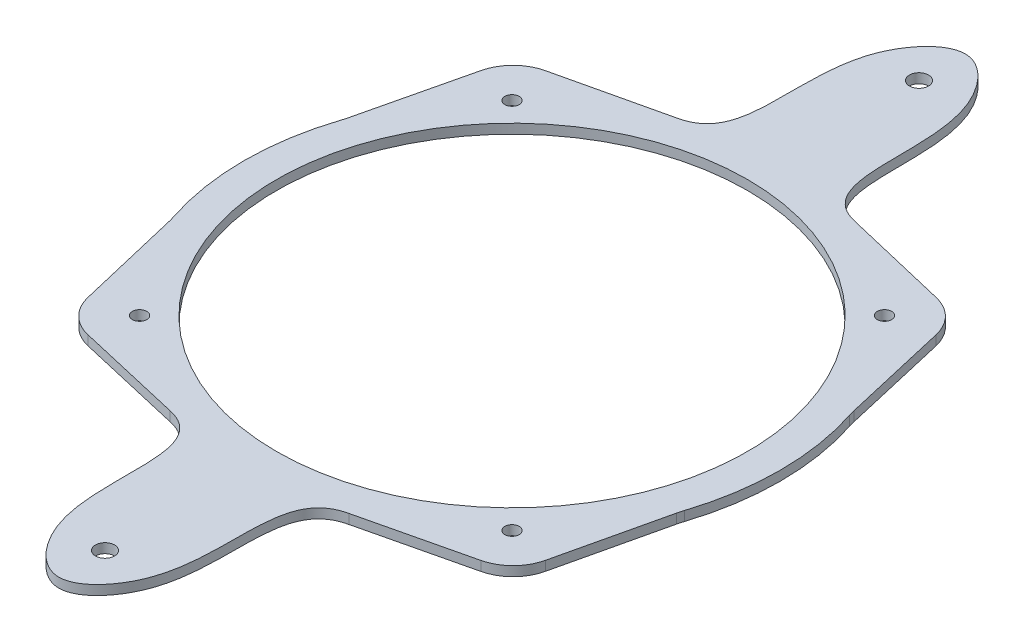
ISO-10303-21;
HEADER;
FILE_DESCRIPTION(('STEP AP214'),'2;1');
FILE_NAME('part.step','',(''),(''),'','','');
FILE_SCHEMA(('AUTOMOTIVE_DESIGN { 1 0 10303 214 1 1 1 1 }'));
ENDSEC;
DATA;
#1=APPLICATION_CONTEXT('core data for automotive mechanical design processes');
#2=APPLICATION_PROTOCOL_DEFINITION('international standard','automotive_design',2000,#1);
#3=PRODUCT_CONTEXT('',#1,'mechanical');
#4=PRODUCT('Part','Part','',(#3));
#5=PRODUCT_RELATED_PRODUCT_CATEGORY('part','',(#4));
#6=PRODUCT_DEFINITION_FORMATION('','',#4);
#7=PRODUCT_DEFINITION_CONTEXT('part definition',#1,'design');
#8=PRODUCT_DEFINITION('design','',#6,#7);
#9=PRODUCT_DEFINITION_SHAPE('','',#8);
#10=(LENGTH_UNIT() NAMED_UNIT(*) SI_UNIT(.MILLI.,.METRE.));
#11=(NAMED_UNIT(*) PLANE_ANGLE_UNIT() SI_UNIT($,.RADIAN.));
#12=(NAMED_UNIT(*) SI_UNIT($,.STERADIAN.) SOLID_ANGLE_UNIT());
#13=UNCERTAINTY_MEASURE_WITH_UNIT(LENGTH_MEASURE(1.E-05),#10,'distance_accuracy_value','');
#14=(GEOMETRIC_REPRESENTATION_CONTEXT(3) GLOBAL_UNCERTAINTY_ASSIGNED_CONTEXT((#13)) GLOBAL_UNIT_ASSIGNED_CONTEXT((#10,
#11,#12)) REPRESENTATION_CONTEXT('',''));
#15=CARTESIAN_POINT('',(0.,0.,0.));
#16=DIRECTION('',(0.,0.,1.));
#17=DIRECTION('',(1.,0.,0.));
#18=AXIS2_PLACEMENT_3D('',#15,#16,#17);
#19=CARTESIAN_POINT('',(-38.7862220051282,2.,-38.9952430761568));
#20=DIRECTION('',(0.,1.,0.));
#21=DIRECTION('',(0.,0.,1.));
#22=AXIS2_PLACEMENT_3D('',#19,#20,#21);
#23=PLANE('',#22);
#24=CARTESIAN_POINT('',(6.93889390390723E-13,2.,-85.));
#25=DIRECTION('',(0.,1.,0.));
#26=DIRECTION('',(0.,0.,1.));
#27=AXIS2_PLACEMENT_3D('',#24,#25,#26);
#28=CIRCLE('',#27,2.);
#29=CARTESIAN_POINT('',(6.93889390390723E-13,2.,-83.));
#30=VERTEX_POINT('',#29);
#31=EDGE_CURVE('E418',#30,#30,#28,.T.);
#32=ORIENTED_EDGE('',*,*,#31,.F.);
#33=EDGE_LOOP('',(#32));
#34=FACE_BOUND('',#33,.T.);
#35=CARTESIAN_POINT('',(-38.8906999999993,2.,38.8907000000005));
#36=DIRECTION('',(0.,1.,0.));
#37=DIRECTION('',(0.,0.,-1.));
#38=AXIS2_PLACEMENT_3D('',#35,#36,#37);
#39=CIRCLE('',#38,1.5);
#40=CARTESIAN_POINT('',(-38.8906999999993,2.,37.3907000000005));
#41=VERTEX_POINT('',#40);
#42=EDGE_CURVE('E402',#41,#41,#39,.T.);
#43=ORIENTED_EDGE('',*,*,#42,.F.);
#44=EDGE_LOOP('',(#43));
#45=FACE_BOUND('',#44,.T.);
#46=CARTESIAN_POINT('',(38.8907000000007,2.,-38.8906999999996));
#47=DIRECTION('',(0.,1.,0.));
#48=DIRECTION('',(0.,0.,-1.));
#49=AXIS2_PLACEMENT_3D('',#46,#47,#48);
#50=CIRCLE('',#49,1.5);
#51=CARTESIAN_POINT('',(38.8907000000007,2.,-40.3906999999996));
#52=VERTEX_POINT('',#51);
#53=EDGE_CURVE('E386',#52,#52,#50,.T.);
#54=ORIENTED_EDGE('',*,*,#53,.F.);
#55=EDGE_LOOP('',(#54));
#56=FACE_BOUND('',#55,.T.);
#57=CARTESIAN_POINT('',(-38.7862220051282,2.,-38.9952430761568));
#58=DIRECTION('',(0.,1.,0.));
#59=DIRECTION('',(0.,0.,1.));
#60=AXIS2_PLACEMENT_3D('',#57,#58,#59);
#61=CIRCLE('',#60,8.99999999999932);
#62=CARTESIAN_POINT('',(-40.8164016405644,2.,-47.7632742489942));
#63=VERTEX_POINT('',#62);
#64=CARTESIAN_POINT('',(-47.5432152727305,2.,-41.0725174709242));
#65=VERTEX_POINT('',#64);
#66=EDGE_CURVE('E318',#63,#65,#61,.T.);
#67=ORIENTED_EDGE('',*,*,#66,.T.);
#68=DIRECTION('',(-0.230808266085293,0.,0.972999251955879));
#69=VECTOR('',#68,1.);
#70=CARTESIAN_POINT('',(-52.8217319837832,2.,-18.8203126500064));
#71=LINE('',#70,#69);
#72=CARTESIAN_POINT('',(-52.8217319837832,2.,-18.8203126500064));
#73=VERTEX_POINT('',#72);
#74=EDGE_CURVE('E138',#65,#73,#71,.T.);
#75=ORIENTED_EDGE('',*,*,#74,.T.);
#76=CARTESIAN_POINT('',(-68.3897200150771,2.,-22.5132449073711));
#77=DIRECTION('',(0.,-1.,0.));
#78=DIRECTION('',(0.,0.,1.));
#79=AXIS2_PLACEMENT_3D('',#76,#77,#78);
#80=CIRCLE('',#79,15.9999999999999);
#81=CARTESIAN_POINT('',(-53.1920044561713,2.,-17.5103015946212));
#82=VERTEX_POINT('',#81);
#83=EDGE_CURVE('E313',#73,#82,#80,.T.);
#84=ORIENTED_EDGE('',*,*,#83,.T.);
#85=CARTESIAN_POINT('',(3.88578058618805E-13,2.,3.85108611666851E-13));
#86=DIRECTION('',(0.,1.,0.));
#87=DIRECTION('',(0.,0.,1.));
#88=AXIS2_PLACEMENT_3D('',#85,#86,#87);
#89=CIRCLE('',#88,56.);
#90=CARTESIAN_POINT('',(-53.1920044561713,2.,17.5103015946221));
#91=VERTEX_POINT('',#90);
#92=EDGE_CURVE('E310',#82,#91,#89,.T.);
#93=ORIENTED_EDGE('',*,*,#92,.T.);
#94=CARTESIAN_POINT('',(-68.3897200150771,2.,22.513244907372));
#95=DIRECTION('',(0.,-1.,0.));
#96=DIRECTION('',(0.,0.,-1.));
#97=AXIS2_PLACEMENT_3D('',#94,#95,#96);
#98=CIRCLE('',#97,15.9999999999999);
#99=CARTESIAN_POINT('',(-52.8217319837832,2.,18.8203126500073));
#100=VERTEX_POINT('',#99);
#101=EDGE_CURVE('E307',#91,#100,#98,.T.);
#102=ORIENTED_EDGE('',*,*,#101,.T.);
#103=DIRECTION('',(0.230808266085293,0.,0.972999251955879));
#104=VECTOR('',#103,1.);
#105=CARTESIAN_POINT('',(-52.8217319837832,2.,18.8203126500073));
#106=LINE('',#105,#104);
#107=CARTESIAN_POINT('',(-47.5432152727305,2.,41.0725174709251));
#108=VERTEX_POINT('',#107);
#109=EDGE_CURVE('E305',#100,#108,#106,.T.);
#110=ORIENTED_EDGE('',*,*,#109,.T.);
#111=CARTESIAN_POINT('',(-38.7862220051282,2.,38.9952430761577));
#112=DIRECTION('',(0.,1.,0.));
#113=DIRECTION('',(0.,0.,-1.));
#114=AXIS2_PLACEMENT_3D('',#111,#112,#113);
#115=CIRCLE('',#114,8.99999999999932);
#116=CARTESIAN_POINT('',(-40.8164016405644,2.,47.7632742489951));
#117=VERTEX_POINT('',#116);
#118=EDGE_CURVE('E303',#108,#117,#115,.T.);
#119=ORIENTED_EDGE('',*,*,#118,.T.);
#120=DIRECTION('',(0.974225685870893,0.,0.225575515048483));
#121=VECTOR('',#120,1.);
#122=CARTESIAN_POINT('',(-40.8164016405644,2.,47.7632742489951));
#123=LINE('',#122,#121);
#124=CARTESIAN_POINT('',(-18.5361486391086,2.,52.9221194930724));
#125=VERTEX_POINT('',#124);
#126=EDGE_CURVE('E276',#117,#125,#123,.T.);
#127=ORIENTED_EDGE('',*,*,#126,.T.);
#128=CARTESIAN_POINT('',(-18.5361486391086,2.,52.9221194930724));
#129=CARTESIAN_POINT('',(-6.536634722786,2.,55.4554250092448));
#130=CARTESIAN_POINT('',(-17.450586634744,2.,79.5032742089071));
#131=CARTESIAN_POINT('',(0.00798678998074194,2.,98.6838426986929));
#132=CARTESIAN_POINT('',(17.4365259114073,2.,79.4327843567498));
#133=CARTESIAN_POINT('',(6.79622758565099,2.,55.4361205118175));
#134=CARTESIAN_POINT('',(18.8203126500043,2.,52.8217319837792));
#135=B_SPLINE_CURVE_WITH_KNOTS('',3,(#128,#129,#130,#131,#132,#133,#134),.UNSPECIFIED.,.F.,.F.,
(4,1,1,1,4),(0.,0.36619004632466,0.499165373384125,0.632140700443589,1.),.UNSPECIFIED.);
#136=CARTESIAN_POINT('',(18.8203126500042,2.,52.8217319837801));
#137=VERTEX_POINT('',#136);
#138=EDGE_CURVE('E268',#125,#137,#135,.T.);
#139=ORIENTED_EDGE('',*,*,#138,.T.);
#140=DIRECTION('',(0.97299925195588,0.,-0.230808266085289));
#141=VECTOR('',#140,1.);
#142=CARTESIAN_POINT('',(18.8203126500042,2.,52.8217319837801));
#143=LINE('',#142,#141);
#144=CARTESIAN_POINT('',(41.072517470927,2.,47.5432152727264));
#145=VERTEX_POINT('',#144);
#146=EDGE_CURVE('E275',#137,#145,#143,.T.);
#147=ORIENTED_EDGE('',*,*,#146,.T.);
#148=CARTESIAN_POINT('',(38.9952430761595,2.,38.786222005124));
#149=DIRECTION('',(0.,1.,0.));
#150=DIRECTION('',(0.,0.,-1.));
#151=AXIS2_PLACEMENT_3D('',#148,#149,#150);
#152=CIRCLE('',#151,8.9999999999994);
#153=CARTESIAN_POINT('',(47.763274248997,2.,40.8164016405602));
#154=VERTEX_POINT('',#153);
#155=EDGE_CURVE('E283',#145,#154,#152,.T.);
#156=ORIENTED_EDGE('',*,*,#155,.T.);
#157=DIRECTION('',(0.22557551504848,0.,-0.974225685870894));
#158=VECTOR('',#157,1.);
#159=CARTESIAN_POINT('',(47.763274248997,2.,40.8164016405602));
#160=LINE('',#159,#158);
#161=CARTESIAN_POINT('',(52.9221194930679,2.,18.5361486391355));
#162=VERTEX_POINT('',#161);
#163=EDGE_CURVE('E286',#154,#162,#160,.T.);
#164=ORIENTED_EDGE('',*,*,#163,.T.);
#165=CARTESIAN_POINT('',(68.5097304670016,2.,22.1453568799111));
#166=DIRECTION('',(0.,-1.,0.));
#167=DIRECTION('',(0.,0.,-1.));
#168=AXIS2_PLACEMENT_3D('',#165,#166,#167);
#169=CIRCLE('',#168,15.9999999999995);
#170=CARTESIAN_POINT('',(53.2853459187792,2.,17.2241664621533));
#171=VERTEX_POINT('',#170);
#172=EDGE_CURVE('E289',#162,#171,#169,.T.);
#173=ORIENTED_EDGE('',*,*,#172,.T.);
#174=CARTESIAN_POINT('',(-1.04655030013431E-12,2.,2.06336822739891E-13));
#175=DIRECTION('',(0.,1.,0.));
#176=DIRECTION('',(0.,0.,1.));
#177=AXIS2_PLACEMENT_3D('',#174,#175,#176);
#178=CIRCLE('',#177,56.0000000000002);
#179=CARTESIAN_POINT('',(53.2853459187793,2.,-17.2241664621525));
#180=VERTEX_POINT('',#179);
#181=EDGE_CURVE('E292',#171,#180,#178,.T.);
#182=ORIENTED_EDGE('',*,*,#181,.T.);
#183=CARTESIAN_POINT('',(68.5097304670016,2.,-22.1453568799102));
#184=DIRECTION('',(0.,-1.,0.));
#185=DIRECTION('',(0.,0.,1.));
#186=AXIS2_PLACEMENT_3D('',#183,#184,#185);
#187=CIRCLE('',#186,15.9999999999995);
#188=CARTESIAN_POINT('',(52.9221194930679,2.,-18.5361486391347));
#189=VERTEX_POINT('',#188);
#190=EDGE_CURVE('E295',#180,#189,#187,.T.);
#191=ORIENTED_EDGE('',*,*,#190,.T.);
#192=DIRECTION('',(-0.22557551504848,0.,-0.974225685870894));
#193=VECTOR('',#192,1.);
#194=CARTESIAN_POINT('',(47.763274248997,2.,-40.8164016405593));
#195=LINE('',#194,#193);
#196=CARTESIAN_POINT('',(47.763274248997,2.,-40.8164016405593));
#197=VERTEX_POINT('',#196);
#198=EDGE_CURVE('E298',#189,#197,#195,.T.);
#199=ORIENTED_EDGE('',*,*,#198,.T.);
#200=CARTESIAN_POINT('',(38.9952430761595,2.,-38.7862220051232));
#201=DIRECTION('',(0.,1.,0.));
#202=DIRECTION('',(0.,0.,1.));
#203=AXIS2_PLACEMENT_3D('',#200,#201,#202);
#204=CIRCLE('',#203,8.9999999999994);
#205=CARTESIAN_POINT('',(41.072517470927,2.,-47.5432152727255));
#206=VERTEX_POINT('',#205);
#207=EDGE_CURVE('E193',#197,#206,#204,.T.);
#208=ORIENTED_EDGE('',*,*,#207,.T.);
#209=DIRECTION('',(-0.97299925195588,0.,-0.230808266085289));
#210=VECTOR('',#209,1.);
#211=CARTESIAN_POINT('',(18.8203126500042,2.,-52.8217319837792));
#212=LINE('',#211,#210);
#213=CARTESIAN_POINT('',(18.8203126500043,2.,-52.8217319837792));
#214=VERTEX_POINT('',#213);
#215=EDGE_CURVE('E187',#206,#214,#212,.T.);
#216=ORIENTED_EDGE('',*,*,#215,.T.);
#217=CARTESIAN_POINT('',(18.8203126500043,2.,-52.8217319837792));
#218=CARTESIAN_POINT('',(6.79622758565085,2.,-55.4361205118174));
#219=CARTESIAN_POINT('',(17.4365259114074,2.,-79.4327843567499));
#220=CARTESIAN_POINT('',(0.00798678998073036,2.,-98.6838426986929));
#221=CARTESIAN_POINT('',(-17.450586634744,2.,-79.5032742089071));
#222=CARTESIAN_POINT('',(-6.53663472278595,2.,-55.4554250092448));
#223=CARTESIAN_POINT('',(-18.5361486391086,2.,-52.9221194930724));
#224=B_SPLINE_CURVE_WITH_KNOTS('',3,(#217,#218,#219,#220,#221,#222,#223),.UNSPECIFIED.,.F.,.F.,
(4,1,1,1,4),(0.,0.367859299556411,0.500834626615875,0.63380995367534,1.),.UNSPECIFIED.);
#225=CARTESIAN_POINT('',(-18.5361486391085,2.,-52.9221194930725));
#226=VERTEX_POINT('',#225);
#227=EDGE_CURVE('E191',#214,#226,#224,.T.);
#228=ORIENTED_EDGE('',*,*,#227,.T.);
#229=DIRECTION('',(-0.974225685870893,0.,0.225575515048483));
#230=VECTOR('',#229,1.);
#231=CARTESIAN_POINT('',(-40.8164016405644,2.,-47.7632742489942));
#232=LINE('',#231,#230);
#233=EDGE_CURVE('E59',#226,#63,#232,.T.);
#234=ORIENTED_EDGE('',*,*,#233,.T.);
#235=EDGE_LOOP('',(#67,#75,#84,#93,#102,#110,#119,#127,#139,#147,#156,#164,#173,#182,#191,#199,
#208,#216,#228,#234));
#236=FACE_BOUND('',#235,.T.);
#237=CARTESIAN_POINT('',(-38.8906999999993,2.,-38.8906999999996));
#238=DIRECTION('',(0.,1.,0.));
#239=DIRECTION('',(0.,0.,1.));
#240=AXIS2_PLACEMENT_3D('',#237,#238,#239);
#241=CIRCLE('',#240,1.5);
#242=CARTESIAN_POINT('',(-38.8906999999993,2.,-37.3906999999996));
#243=VERTEX_POINT('',#242);
#244=EDGE_CURVE('E379',#243,#243,#241,.T.);
#245=ORIENTED_EDGE('',*,*,#244,.F.);
#246=EDGE_LOOP('',(#245));
#247=FACE_BOUND('',#246,.T.);
#248=CARTESIAN_POINT('',(38.8907000000007,2.,38.8907000000005));
#249=DIRECTION('',(0.,1.,0.));
#250=DIRECTION('',(0.,0.,1.));
#251=AXIS2_PLACEMENT_3D('',#248,#249,#250);
#252=CIRCLE('',#251,1.5);
#253=CARTESIAN_POINT('',(38.8907000000007,2.,40.3907000000005));
#254=VERTEX_POINT('',#253);
#255=EDGE_CURVE('E394',#254,#254,#252,.T.);
#256=ORIENTED_EDGE('',*,*,#255,.F.);
#257=EDGE_LOOP('',(#256));
#258=FACE_BOUND('',#257,.T.);
#259=CARTESIAN_POINT('',(-1.04655030013431E-12,2.,2.06336822739891E-13));
#260=DIRECTION('',(0.,1.,0.));
#261=DIRECTION('',(0.,0.,1.));
#262=AXIS2_PLACEMENT_3D('',#259,#260,#261);
#263=CIRCLE('',#262,49.2);
#264=CARTESIAN_POINT('',(-1.04655030013431E-12,2.,49.2000000000002));
#265=VERTEX_POINT('',#264);
#266=EDGE_CURVE('E410',#265,#265,#263,.T.);
#267=ORIENTED_EDGE('',*,*,#266,.F.);
#268=EDGE_LOOP('',(#267));
#269=FACE_BOUND('',#268,.T.);
#270=CARTESIAN_POINT('',(6.93889390390723E-13,2.,85.));
#271=DIRECTION('',(0.,1.,0.));
#272=DIRECTION('',(0.,0.,-1.));
#273=AXIS2_PLACEMENT_3D('',#270,#271,#272);
#274=CIRCLE('',#273,2.);
#275=CARTESIAN_POINT('',(6.93889390390723E-13,2.,83.));
#276=VERTEX_POINT('',#275);
#277=EDGE_CURVE('E426',#276,#276,#274,.T.);
#278=ORIENTED_EDGE('',*,*,#277,.F.);
#279=EDGE_LOOP('',(#278));
#280=FACE_BOUND('',#279,.T.);
#281=ADVANCED_FACE('F41',(#34,#45,#56,#236,#247,#258,#269,#280),#23,.T.);
#282=CARTESIAN_POINT('',(-38.7862220051282,0.,-38.9952430761568));
#283=DIRECTION('',(0.,1.,0.));
#284=DIRECTION('',(0.,0.,1.));
#285=AXIS2_PLACEMENT_3D('',#282,#283,#284);
#286=PLANE('',#285);
#287=CARTESIAN_POINT('',(-38.7862220051282,0.,-38.9952430761568));
#288=DIRECTION('',(0.,1.,0.));
#289=DIRECTION('',(0.,0.,1.));
#290=AXIS2_PLACEMENT_3D('',#287,#288,#289);
#291=CIRCLE('',#290,8.99999999999932);
#292=CARTESIAN_POINT('',(-40.8164016405644,0.,-47.7632742489942));
#293=VERTEX_POINT('',#292);
#294=CARTESIAN_POINT('',(-47.5432152727305,0.,-41.0725174709242));
#295=VERTEX_POINT('',#294);
#296=EDGE_CURVE('E375',#293,#295,#291,.T.);
#297=ORIENTED_EDGE('',*,*,#296,.F.);
#298=DIRECTION('',(-0.974225685870893,0.,0.225575515048483));
#299=VECTOR('',#298,1.);
#300=CARTESIAN_POINT('',(-40.8164016405644,0.,-47.7632742489942));
#301=LINE('',#300,#299);
#302=CARTESIAN_POINT('',(-18.5361486391085,0.,-52.9221194930725));
#303=VERTEX_POINT('',#302);
#304=EDGE_CURVE('E130',#303,#293,#301,.T.);
#305=ORIENTED_EDGE('',*,*,#304,.F.);
#306=CARTESIAN_POINT('',(18.8203126500043,0.,-52.8217319837792));
#307=CARTESIAN_POINT('',(6.79622758565085,0.,-55.4361205118174));
#308=CARTESIAN_POINT('',(17.4365259114074,0.,-79.4327843567499));
#309=CARTESIAN_POINT('',(0.00798678998073036,0.,-98.6838426986929));
#310=CARTESIAN_POINT('',(-17.450586634744,0.,-79.5032742089071));
#311=CARTESIAN_POINT('',(-6.53663472278595,0.,-55.4554250092448));
#312=CARTESIAN_POINT('',(-18.5361486391086,0.,-52.9221194930724));
#313=B_SPLINE_CURVE_WITH_KNOTS('',3,(#306,#307,#308,#309,#310,#311,#312),.UNSPECIFIED.,.F.,.F.,
(4,1,1,1,4),(0.,0.367859299556411,0.500834626615875,0.63380995367534,1.),.UNSPECIFIED.);
#314=CARTESIAN_POINT('',(18.8203126500043,0.,-52.8217319837792));
#315=VERTEX_POINT('',#314);
#316=EDGE_CURVE('E124',#315,#303,#313,.T.);
#317=ORIENTED_EDGE('',*,*,#316,.F.);
#318=DIRECTION('',(-0.97299925195588,0.,-0.230808266085289));
#319=VECTOR('',#318,1.);
#320=CARTESIAN_POINT('',(18.8203126500042,0.,-52.8217319837792));
#321=LINE('',#320,#319);
#322=CARTESIAN_POINT('',(41.072517470927,0.,-47.5432152727255));
#323=VERTEX_POINT('',#322);
#324=EDGE_CURVE('E202',#323,#315,#321,.T.);
#325=ORIENTED_EDGE('',*,*,#324,.F.);
#326=CARTESIAN_POINT('',(38.9952430761595,0.,-38.7862220051232));
#327=DIRECTION('',(0.,1.,0.));
#328=DIRECTION('',(0.,0.,1.));
#329=AXIS2_PLACEMENT_3D('',#326,#327,#328);
#330=CIRCLE('',#329,8.9999999999994);
#331=CARTESIAN_POINT('',(47.763274248997,0.,-40.8164016405593));
#332=VERTEX_POINT('',#331);
#333=EDGE_CURVE('E327',#332,#323,#330,.T.);
#334=ORIENTED_EDGE('',*,*,#333,.F.);
#335=DIRECTION('',(-0.22557551504848,0.,-0.974225685870894));
#336=VECTOR('',#335,1.);
#337=CARTESIAN_POINT('',(47.763274248997,0.,-40.8164016405593));
#338=LINE('',#337,#336);
#339=CARTESIAN_POINT('',(52.9221194930679,0.,-18.5361486391347));
#340=VERTEX_POINT('',#339);
#341=EDGE_CURVE('E330',#340,#332,#338,.T.);
#342=ORIENTED_EDGE('',*,*,#341,.F.);
#343=CARTESIAN_POINT('',(68.5097304670016,0.,-22.1453568799102));
#344=DIRECTION('',(0.,-1.,0.));
#345=DIRECTION('',(0.,0.,1.));
#346=AXIS2_PLACEMENT_3D('',#343,#344,#345);
#347=CIRCLE('',#346,15.9999999999995);
#348=CARTESIAN_POINT('',(53.2853459187793,0.,-17.2241664621525));
#349=VERTEX_POINT('',#348);
#350=EDGE_CURVE('E333',#349,#340,#347,.T.);
#351=ORIENTED_EDGE('',*,*,#350,.F.);
#352=CARTESIAN_POINT('',(-1.04655030013431E-12,0.,2.06336822739891E-13));
#353=DIRECTION('',(0.,1.,0.));
#354=DIRECTION('',(0.,0.,1.));
#355=AXIS2_PLACEMENT_3D('',#352,#353,#354);
#356=CIRCLE('',#355,56.0000000000002);
#357=CARTESIAN_POINT('',(53.2853459187792,0.,17.2241664621533));
#358=VERTEX_POINT('',#357);
#359=EDGE_CURVE('E336',#358,#349,#356,.T.);
#360=ORIENTED_EDGE('',*,*,#359,.F.);
#361=CARTESIAN_POINT('',(68.5097304670016,0.,22.1453568799111));
#362=DIRECTION('',(0.,-1.,0.));
#363=DIRECTION('',(0.,0.,-1.));
#364=AXIS2_PLACEMENT_3D('',#361,#362,#363);
#365=CIRCLE('',#364,15.9999999999995);
#366=CARTESIAN_POINT('',(52.9221194930679,0.,18.5361486391355));
#367=VERTEX_POINT('',#366);
#368=EDGE_CURVE('E339',#367,#358,#365,.T.);
#369=ORIENTED_EDGE('',*,*,#368,.F.);
#370=DIRECTION('',(0.22557551504848,0.,-0.974225685870894));
#371=VECTOR('',#370,1.);
#372=CARTESIAN_POINT('',(47.763274248997,0.,40.8164016405602));
#373=LINE('',#372,#371);
#374=CARTESIAN_POINT('',(47.763274248997,0.,40.8164016405602));
#375=VERTEX_POINT('',#374);
#376=EDGE_CURVE('E342',#375,#367,#373,.T.);
#377=ORIENTED_EDGE('',*,*,#376,.F.);
#378=CARTESIAN_POINT('',(38.9952430761595,0.,38.786222005124));
#379=DIRECTION('',(0.,1.,0.));
#380=DIRECTION('',(0.,0.,-1.));
#381=AXIS2_PLACEMENT_3D('',#378,#379,#380);
#382=CIRCLE('',#381,8.9999999999994);
#383=CARTESIAN_POINT('',(41.072517470927,0.,47.5432152727264));
#384=VERTEX_POINT('',#383);
#385=EDGE_CURVE('E345',#384,#375,#382,.T.);
#386=ORIENTED_EDGE('',*,*,#385,.F.);
#387=DIRECTION('',(0.97299925195588,0.,-0.230808266085289));
#388=VECTOR('',#387,1.);
#389=CARTESIAN_POINT('',(18.8203126500042,0.,52.8217319837801));
#390=LINE('',#389,#388);
#391=CARTESIAN_POINT('',(18.8203126500042,0.,52.8217319837801));
#392=VERTEX_POINT('',#391);
#393=EDGE_CURVE('E348',#392,#384,#390,.T.);
#394=ORIENTED_EDGE('',*,*,#393,.F.);
#395=CARTESIAN_POINT('',(-18.5361486391086,0.,52.9221194930724));
#396=CARTESIAN_POINT('',(-6.536634722786,0.,55.4554250092448));
#397=CARTESIAN_POINT('',(-17.450586634744,0.,79.5032742089071));
#398=CARTESIAN_POINT('',(0.00798678998074194,0.,98.6838426986929));
#399=CARTESIAN_POINT('',(17.4365259114073,0.,79.4327843567498));
#400=CARTESIAN_POINT('',(6.79622758565099,0.,55.4361205118175));
#401=CARTESIAN_POINT('',(18.8203126500043,0.,52.8217319837792));
#402=B_SPLINE_CURVE_WITH_KNOTS('',3,(#395,#396,#397,#398,#399,#400,#401),.UNSPECIFIED.,.F.,.F.,
(4,1,1,1,4),(0.,0.36619004632466,0.499165373384125,0.632140700443589,1.),.UNSPECIFIED.);
#403=CARTESIAN_POINT('',(-18.5361486391086,0.,52.9221194930724));
#404=VERTEX_POINT('',#403);
#405=EDGE_CURVE('E351',#404,#392,#402,.T.);
#406=ORIENTED_EDGE('',*,*,#405,.F.);
#407=DIRECTION('',(0.974225685870893,0.,0.225575515048483));
#408=VECTOR('',#407,1.);
#409=CARTESIAN_POINT('',(-40.8164016405644,0.,47.7632742489951));
#410=LINE('',#409,#408);
#411=CARTESIAN_POINT('',(-40.8164016405644,0.,47.7632742489951));
#412=VERTEX_POINT('',#411);
#413=EDGE_CURVE('E354',#412,#404,#410,.T.);
#414=ORIENTED_EDGE('',*,*,#413,.F.);
#415=CARTESIAN_POINT('',(-38.7862220051282,0.,38.9952430761577));
#416=DIRECTION('',(0.,1.,0.));
#417=DIRECTION('',(0.,0.,-1.));
#418=AXIS2_PLACEMENT_3D('',#415,#416,#417);
#419=CIRCLE('',#418,8.99999999999932);
#420=CARTESIAN_POINT('',(-47.5432152727305,0.,41.0725174709251));
#421=VERTEX_POINT('',#420);
#422=EDGE_CURVE('E357',#421,#412,#419,.T.);
#423=ORIENTED_EDGE('',*,*,#422,.F.);
#424=DIRECTION('',(0.230808266085293,0.,0.972999251955879));
#425=VECTOR('',#424,1.);
#426=CARTESIAN_POINT('',(-52.8217319837832,0.,18.8203126500073));
#427=LINE('',#426,#425);
#428=CARTESIAN_POINT('',(-52.8217319837832,0.,18.8203126500073));
#429=VERTEX_POINT('',#428);
#430=EDGE_CURVE('E360',#429,#421,#427,.T.);
#431=ORIENTED_EDGE('',*,*,#430,.F.);
#432=CARTESIAN_POINT('',(-68.3897200150771,0.,22.513244907372));
#433=DIRECTION('',(0.,-1.,0.));
#434=DIRECTION('',(0.,0.,-1.));
#435=AXIS2_PLACEMENT_3D('',#432,#433,#434);
#436=CIRCLE('',#435,15.9999999999999);
#437=CARTESIAN_POINT('',(-53.1920044561713,0.,17.5103015946221));
#438=VERTEX_POINT('',#437);
#439=EDGE_CURVE('E363',#438,#429,#436,.T.);
#440=ORIENTED_EDGE('',*,*,#439,.F.);
#441=CARTESIAN_POINT('',(3.88578058618805E-13,0.,3.85108611666851E-13));
#442=DIRECTION('',(0.,1.,0.));
#443=DIRECTION('',(0.,0.,1.));
#444=AXIS2_PLACEMENT_3D('',#441,#442,#443);
#445=CIRCLE('',#444,56.);
#446=CARTESIAN_POINT('',(-53.1920044561713,0.,-17.5103015946212));
#447=VERTEX_POINT('',#446);
#448=EDGE_CURVE('E366',#447,#438,#445,.T.);
#449=ORIENTED_EDGE('',*,*,#448,.F.);
#450=CARTESIAN_POINT('',(-68.3897200150771,0.,-22.5132449073711));
#451=DIRECTION('',(0.,-1.,0.));
#452=DIRECTION('',(0.,0.,1.));
#453=AXIS2_PLACEMENT_3D('',#450,#451,#452);
#454=CIRCLE('',#453,15.9999999999999);
#455=CARTESIAN_POINT('',(-52.8217319837832,0.,-18.8203126500064));
#456=VERTEX_POINT('',#455);
#457=EDGE_CURVE('E369',#456,#447,#454,.T.);
#458=ORIENTED_EDGE('',*,*,#457,.F.);
#459=DIRECTION('',(-0.230808266085293,0.,0.972999251955879));
#460=VECTOR('',#459,1.);
#461=CARTESIAN_POINT('',(-52.8217319837832,0.,-18.8203126500064));
#462=LINE('',#461,#460);
#463=EDGE_CURVE('E372',#295,#456,#462,.T.);
#464=ORIENTED_EDGE('',*,*,#463,.F.);
#465=EDGE_LOOP('',(#297,#305,#317,#325,#334,#342,#351,#360,#369,#377,#386,#394,#406,#414,#423,
#431,#440,#449,#458,#464));
#466=FACE_BOUND('',#465,.T.);
#467=CARTESIAN_POINT('',(-38.8906999999993,0.,-38.8906999999996));
#468=DIRECTION('',(0.,1.,0.));
#469=DIRECTION('',(0.,0.,1.));
#470=AXIS2_PLACEMENT_3D('',#467,#468,#469);
#471=CIRCLE('',#470,1.5);
#472=CARTESIAN_POINT('',(-38.8906999999993,0.,-37.3906999999996));
#473=VERTEX_POINT('',#472);
#474=EDGE_CURVE('E382',#473,#473,#471,.T.);
#475=ORIENTED_EDGE('',*,*,#474,.T.);
#476=EDGE_LOOP('',(#475));
#477=FACE_BOUND('',#476,.T.);
#478=CARTESIAN_POINT('',(38.8907000000007,0.,-38.8906999999996));
#479=DIRECTION('',(0.,1.,0.));
#480=DIRECTION('',(0.,0.,-1.));
#481=AXIS2_PLACEMENT_3D('',#478,#479,#480);
#482=CIRCLE('',#481,1.5);
#483=CARTESIAN_POINT('',(38.8907000000007,0.,-40.3906999999996));
#484=VERTEX_POINT('',#483);
#485=EDGE_CURVE('E390',#484,#484,#482,.T.);
#486=ORIENTED_EDGE('',*,*,#485,.T.);
#487=EDGE_LOOP('',(#486));
#488=FACE_BOUND('',#487,.T.);
#489=CARTESIAN_POINT('',(38.8907000000007,0.,38.8907000000005));
#490=DIRECTION('',(0.,1.,0.));
#491=DIRECTION('',(0.,0.,1.));
#492=AXIS2_PLACEMENT_3D('',#489,#490,#491);
#493=CIRCLE('',#492,1.5);
#494=CARTESIAN_POINT('',(38.8907000000007,0.,40.3907000000005));
#495=VERTEX_POINT('',#494);
#496=EDGE_CURVE('E398',#495,#495,#493,.T.);
#497=ORIENTED_EDGE('',*,*,#496,.T.);
#498=EDGE_LOOP('',(#497));
#499=FACE_BOUND('',#498,.T.);
#500=CARTESIAN_POINT('',(-38.8906999999993,0.,38.8907000000005));
#501=DIRECTION('',(0.,1.,0.));
#502=DIRECTION('',(0.,0.,-1.));
#503=AXIS2_PLACEMENT_3D('',#500,#501,#502);
#504=CIRCLE('',#503,1.5);
#505=CARTESIAN_POINT('',(-38.8906999999993,0.,37.3907000000005));
#506=VERTEX_POINT('',#505);
#507=EDGE_CURVE('E406',#506,#506,#504,.T.);
#508=ORIENTED_EDGE('',*,*,#507,.T.);
#509=EDGE_LOOP('',(#508));
#510=FACE_BOUND('',#509,.T.);
#511=CARTESIAN_POINT('',(-1.04655030013431E-12,0.,2.06336822739891E-13));
#512=DIRECTION('',(0.,1.,0.));
#513=DIRECTION('',(0.,0.,1.));
#514=AXIS2_PLACEMENT_3D('',#511,#512,#513);
#515=CIRCLE('',#514,49.2);
#516=CARTESIAN_POINT('',(-1.04655030013431E-12,0.,49.2000000000002));
#517=VERTEX_POINT('',#516);
#518=EDGE_CURVE('E414',#517,#517,#515,.T.);
#519=ORIENTED_EDGE('',*,*,#518,.T.);
#520=EDGE_LOOP('',(#519));
#521=FACE_BOUND('',#520,.T.);
#522=CARTESIAN_POINT('',(6.93889390390723E-13,0.,-85.));
#523=DIRECTION('',(0.,1.,0.));
#524=DIRECTION('',(0.,0.,1.));
#525=AXIS2_PLACEMENT_3D('',#522,#523,#524);
#526=CIRCLE('',#525,2.);
#527=CARTESIAN_POINT('',(6.93889390390723E-13,0.,-83.));
#528=VERTEX_POINT('',#527);
#529=EDGE_CURVE('E422',#528,#528,#526,.T.);
#530=ORIENTED_EDGE('',*,*,#529,.T.);
#531=EDGE_LOOP('',(#530));
#532=FACE_BOUND('',#531,.T.);
#533=CARTESIAN_POINT('',(6.93889390390723E-13,0.,85.));
#534=DIRECTION('',(0.,1.,0.));
#535=DIRECTION('',(0.,0.,-1.));
#536=AXIS2_PLACEMENT_3D('',#533,#534,#535);
#537=CIRCLE('',#536,2.);
#538=CARTESIAN_POINT('',(6.93889390390723E-13,0.,83.));
#539=VERTEX_POINT('',#538);
#540=EDGE_CURVE('E430',#539,#539,#537,.T.);
#541=ORIENTED_EDGE('',*,*,#540,.T.);
#542=EDGE_LOOP('',(#541));
#543=FACE_BOUND('',#542,.T.);
#544=ADVANCED_FACE('F436',(#466,#477,#488,#499,#510,#521,#532,#543),#286,.F.);
#545=CARTESIAN_POINT('',(-38.7862220051282,2.,-38.9952430761568));
#546=DIRECTION('',(0.,-1.,0.));
#547=DIRECTION('',(0.,0.,-1.));
#548=AXIS2_PLACEMENT_3D('',#545,#546,#547);
#549=CYLINDRICAL_SURFACE('',#548,8.99999999999932);
#550=ORIENTED_EDGE('',*,*,#296,.T.);
#551=DIRECTION('',(0.,-1.,0.));
#552=VECTOR('',#551,1.);
#553=CARTESIAN_POINT('',(-47.5432152727305,2.,-41.0725174709242));
#554=LINE('',#553,#552);
#555=EDGE_CURVE('E11',#65,#295,#554,.T.);
#556=ORIENTED_EDGE('',*,*,#555,.F.);
#557=ORIENTED_EDGE('',*,*,#66,.F.);
#558=DIRECTION('',(0.,-1.,0.));
#559=VECTOR('',#558,1.);
#560=CARTESIAN_POINT('',(-40.8164016405644,2.,-47.7632742489942));
#561=LINE('',#560,#559);
#562=EDGE_CURVE('E211',#63,#293,#561,.T.);
#563=ORIENTED_EDGE('',*,*,#562,.T.);
#564=EDGE_LOOP('',(#550,#556,#557,#563));
#565=FACE_BOUND('',#564,.T.);
#566=ADVANCED_FACE('F43',(#565),#549,.T.);
#567=CARTESIAN_POINT('',(-52.8217319837832,2.,-18.8203126500064));
#568=DIRECTION('',(0.972999251955879,0.,0.230808266085293));
#569=DIRECTION('',(0.230808266085293,0.,-0.972999251955879));
#570=AXIS2_PLACEMENT_3D('',#567,#568,#569);
#571=PLANE('',#570);
#572=ORIENTED_EDGE('',*,*,#463,.T.);
#573=DIRECTION('',(0.,-1.,0.));
#574=VECTOR('',#573,1.);
#575=CARTESIAN_POINT('',(-52.8217319837832,2.,-18.8203126500064));
#576=LINE('',#575,#574);
#577=EDGE_CURVE('E51',#73,#456,#576,.T.);
#578=ORIENTED_EDGE('',*,*,#577,.F.);
#579=ORIENTED_EDGE('',*,*,#74,.F.);
#580=ORIENTED_EDGE('',*,*,#555,.T.);
#581=EDGE_LOOP('',(#572,#578,#579,#580));
#582=FACE_BOUND('',#581,.T.);
#583=ADVANCED_FACE('F634',(#582),#571,.F.);
#584=CARTESIAN_POINT('',(-68.3897200150771,2.,-22.5132449073711));
#585=DIRECTION('',(0.,-1.,0.));
#586=DIRECTION('',(0.,0.,-1.));
#587=AXIS2_PLACEMENT_3D('',#584,#585,#586);
#588=CYLINDRICAL_SURFACE('',#587,15.9999999999999);
#589=ORIENTED_EDGE('',*,*,#457,.T.);
#590=DIRECTION('',(0.,-1.,0.));
#591=VECTOR('',#590,1.);
#592=CARTESIAN_POINT('',(-53.1920044561713,2.,-17.5103015946212));
#593=LINE('',#592,#591);
#594=EDGE_CURVE('E694',#82,#447,#593,.T.);
#595=ORIENTED_EDGE('',*,*,#594,.F.);
#596=ORIENTED_EDGE('',*,*,#83,.F.);
#597=ORIENTED_EDGE('',*,*,#577,.T.);
#598=EDGE_LOOP('',(#589,#595,#596,#597));
#599=FACE_BOUND('',#598,.T.);
#600=ADVANCED_FACE('F625',(#599),#588,.F.);
#601=CARTESIAN_POINT('',(3.88578058618805E-13,2.,3.85108611666851E-13));
#602=DIRECTION('',(0.,-1.,0.));
#603=DIRECTION('',(0.,0.,-1.));
#604=AXIS2_PLACEMENT_3D('',#601,#602,#603);
#605=CYLINDRICAL_SURFACE('',#604,56.);
#606=ORIENTED_EDGE('',*,*,#448,.T.);
#607=DIRECTION('',(0.,-1.,0.));
#608=VECTOR('',#607,1.);
#609=CARTESIAN_POINT('',(-53.1920044561713,2.,17.5103015946221));
#610=LINE('',#609,#608);
#611=EDGE_CURVE('E696',#91,#438,#610,.T.);
#612=ORIENTED_EDGE('',*,*,#611,.F.);
#613=ORIENTED_EDGE('',*,*,#92,.F.);
#614=ORIENTED_EDGE('',*,*,#594,.T.);
#615=EDGE_LOOP('',(#606,#612,#613,#614));
#616=FACE_BOUND('',#615,.T.);
#617=ADVANCED_FACE('F616',(#616),#605,.T.);
#618=CARTESIAN_POINT('',(-68.3897200150771,2.,22.513244907372));
#619=DIRECTION('',(0.,-1.,0.));
#620=DIRECTION('',(0.,0.,-1.));
#621=AXIS2_PLACEMENT_3D('',#618,#619,#620);
#622=CYLINDRICAL_SURFACE('',#621,15.9999999999999);
#623=ORIENTED_EDGE('',*,*,#439,.T.);
#624=DIRECTION('',(0.,-1.,0.));
#625=VECTOR('',#624,1.);
#626=CARTESIAN_POINT('',(-52.8217319837832,2.,18.8203126500073));
#627=LINE('',#626,#625);
#628=EDGE_CURVE('E702',#100,#429,#627,.T.);
#629=ORIENTED_EDGE('',*,*,#628,.F.);
#630=ORIENTED_EDGE('',*,*,#101,.F.);
#631=ORIENTED_EDGE('',*,*,#611,.T.);
#632=EDGE_LOOP('',(#623,#629,#630,#631));
#633=FACE_BOUND('',#632,.T.);
#634=ADVANCED_FACE('F607',(#633),#622,.F.);
#635=CARTESIAN_POINT('',(-52.8217319837832,2.,18.8203126500073));
#636=DIRECTION('',(0.972999251955879,0.,-0.230808266085293));
#637=DIRECTION('',(-0.230808266085293,0.,-0.972999251955879));
#638=AXIS2_PLACEMENT_3D('',#635,#636,#637);
#639=PLANE('',#638);
#640=ORIENTED_EDGE('',*,*,#430,.T.);
#641=DIRECTION('',(0.,-1.,0.));
#642=VECTOR('',#641,1.);
#643=CARTESIAN_POINT('',(-47.5432152727305,2.,41.0725174709251));
#644=LINE('',#643,#642);
#645=EDGE_CURVE('E706',#108,#421,#644,.T.);
#646=ORIENTED_EDGE('',*,*,#645,.F.);
#647=ORIENTED_EDGE('',*,*,#109,.F.);
#648=ORIENTED_EDGE('',*,*,#628,.T.);
#649=EDGE_LOOP('',(#640,#646,#647,#648));
#650=FACE_BOUND('',#649,.T.);
#651=ADVANCED_FACE('F599',(#650),#639,.F.);
#652=CARTESIAN_POINT('',(-38.7862220051282,2.,38.9952430761577));
#653=DIRECTION('',(0.,-1.,0.));
#654=DIRECTION('',(0.,0.,-1.));
#655=AXIS2_PLACEMENT_3D('',#652,#653,#654);
#656=CYLINDRICAL_SURFACE('',#655,8.99999999999932);
#657=ORIENTED_EDGE('',*,*,#422,.T.);
#658=DIRECTION('',(0.,-1.,0.));
#659=VECTOR('',#658,1.);
#660=CARTESIAN_POINT('',(-40.8164016405644,2.,47.7632742489951));
#661=LINE('',#660,#659);
#662=EDGE_CURVE('E710',#117,#412,#661,.T.);
#663=ORIENTED_EDGE('',*,*,#662,.F.);
#664=ORIENTED_EDGE('',*,*,#118,.F.);
#665=ORIENTED_EDGE('',*,*,#645,.T.);
#666=EDGE_LOOP('',(#657,#663,#664,#665));
#667=FACE_BOUND('',#666,.T.);
#668=ADVANCED_FACE('F591',(#667),#656,.T.);
#669=CARTESIAN_POINT('',(-40.8164016405644,2.,47.7632742489951));
#670=DIRECTION('',(0.225575515048483,0.,-0.974225685870893));
#671=DIRECTION('',(-0.974225685870893,0.,-0.225575515048483));
#672=AXIS2_PLACEMENT_3D('',#669,#670,#671);
#673=PLANE('',#672);
#674=ORIENTED_EDGE('',*,*,#413,.T.);
#675=DIRECTION('',(0.,-1.,0.));
#676=VECTOR('',#675,1.);
#677=CARTESIAN_POINT('',(-18.5361486391086,2.,52.9221194930724));
#678=LINE('',#677,#676);
#679=EDGE_CURVE('E714',#125,#404,#678,.T.);
#680=ORIENTED_EDGE('',*,*,#679,.F.);
#681=ORIENTED_EDGE('',*,*,#126,.F.);
#682=ORIENTED_EDGE('',*,*,#662,.T.);
#683=EDGE_LOOP('',(#674,#680,#681,#682));
#684=FACE_BOUND('',#683,.T.);
#685=ADVANCED_FACE('F265',(#684),#673,.F.);
#686=DIRECTION('',(0.,-1.,0.));
#687=VECTOR('',#686,1.);
#688=SURFACE_OF_LINEAR_EXTRUSION('',#135,#687);
#689=ORIENTED_EDGE('',*,*,#405,.T.);
#690=DIRECTION('',(0.,-1.,0.));
#691=VECTOR('',#690,1.);
#692=CARTESIAN_POINT('',(18.8203126500042,2.,52.8217319837801));
#693=LINE('',#692,#691);
#694=EDGE_CURVE('E718',#137,#392,#693,.T.);
#695=ORIENTED_EDGE('',*,*,#694,.F.);
#696=ORIENTED_EDGE('',*,*,#138,.F.);
#697=ORIENTED_EDGE('',*,*,#679,.T.);
#698=EDGE_LOOP('',(#689,#695,#696,#697));
#699=FACE_BOUND('',#698,.T.);
#700=ADVANCED_FACE('F260',(#699),#688,.F.);
#701=CARTESIAN_POINT('',(18.8203126500042,2.,52.8217319837801));
#702=DIRECTION('',(-0.230808266085289,0.,-0.97299925195588));
#703=DIRECTION('',(-0.97299925195588,0.,0.230808266085289));
#704=AXIS2_PLACEMENT_3D('',#701,#702,#703);
#705=PLANE('',#704);
#706=ORIENTED_EDGE('',*,*,#393,.T.);
#707=DIRECTION('',(0.,-1.,0.));
#708=VECTOR('',#707,1.);
#709=CARTESIAN_POINT('',(41.072517470927,2.,47.5432152727264));
#710=LINE('',#709,#708);
#711=EDGE_CURVE('E722',#145,#384,#710,.T.);
#712=ORIENTED_EDGE('',*,*,#711,.F.);
#713=ORIENTED_EDGE('',*,*,#146,.F.);
#714=ORIENTED_EDGE('',*,*,#694,.T.);
#715=EDGE_LOOP('',(#706,#712,#713,#714));
#716=FACE_BOUND('',#715,.T.);
#717=ADVANCED_FACE('F256',(#716),#705,.F.);
#718=CARTESIAN_POINT('',(38.9952430761595,2.,38.786222005124));
#719=DIRECTION('',(0.,-1.,0.));
#720=DIRECTION('',(0.,0.,-1.));
#721=AXIS2_PLACEMENT_3D('',#718,#719,#720);
#722=CYLINDRICAL_SURFACE('',#721,8.9999999999994);
#723=ORIENTED_EDGE('',*,*,#385,.T.);
#724=DIRECTION('',(0.,-1.,0.));
#725=VECTOR('',#724,1.);
#726=CARTESIAN_POINT('',(47.763274248997,2.,40.8164016405602));
#727=LINE('',#726,#725);
#728=EDGE_CURVE('E726',#154,#375,#727,.T.);
#729=ORIENTED_EDGE('',*,*,#728,.F.);
#730=ORIENTED_EDGE('',*,*,#155,.F.);
#731=ORIENTED_EDGE('',*,*,#711,.T.);
#732=EDGE_LOOP('',(#723,#729,#730,#731));
#733=FACE_BOUND('',#732,.T.);
#734=ADVANCED_FACE('F252',(#733),#722,.T.);
#735=CARTESIAN_POINT('',(47.763274248997,2.,40.8164016405602));
#736=DIRECTION('',(-0.974225685870894,0.,-0.22557551504848));
#737=DIRECTION('',(-0.22557551504848,0.,0.974225685870894));
#738=AXIS2_PLACEMENT_3D('',#735,#736,#737);
#739=PLANE('',#738);
#740=ORIENTED_EDGE('',*,*,#376,.T.);
#741=DIRECTION('',(0.,-1.,0.));
#742=VECTOR('',#741,1.);
#743=CARTESIAN_POINT('',(52.9221194930679,2.,18.5361486391355));
#744=LINE('',#743,#742);
#745=EDGE_CURVE('E730',#162,#367,#744,.T.);
#746=ORIENTED_EDGE('',*,*,#745,.F.);
#747=ORIENTED_EDGE('',*,*,#163,.F.);
#748=ORIENTED_EDGE('',*,*,#728,.T.);
#749=EDGE_LOOP('',(#740,#746,#747,#748));
#750=FACE_BOUND('',#749,.T.);
#751=ADVANCED_FACE('F248',(#750),#739,.F.);
#752=CARTESIAN_POINT('',(68.5097304670016,2.,22.1453568799111));
#753=DIRECTION('',(0.,-1.,0.));
#754=DIRECTION('',(0.,0.,-1.));
#755=AXIS2_PLACEMENT_3D('',#752,#753,#754);
#756=CYLINDRICAL_SURFACE('',#755,15.9999999999995);
#757=ORIENTED_EDGE('',*,*,#368,.T.);
#758=DIRECTION('',(0.,-1.,0.));
#759=VECTOR('',#758,1.);
#760=CARTESIAN_POINT('',(53.2853459187792,2.,17.2241664621533));
#761=LINE('',#760,#759);
#762=EDGE_CURVE('E734',#171,#358,#761,.T.);
#763=ORIENTED_EDGE('',*,*,#762,.F.);
#764=ORIENTED_EDGE('',*,*,#172,.F.);
#765=ORIENTED_EDGE('',*,*,#745,.T.);
#766=EDGE_LOOP('',(#757,#763,#764,#765));
#767=FACE_BOUND('',#766,.T.);
#768=ADVANCED_FACE('F244',(#767),#756,.F.);
#769=CARTESIAN_POINT('',(-1.04655030013431E-12,2.,2.06336822739891E-13));
#770=DIRECTION('',(0.,-1.,0.));
#771=DIRECTION('',(0.,0.,-1.));
#772=AXIS2_PLACEMENT_3D('',#769,#770,#771);
#773=CYLINDRICAL_SURFACE('',#772,56.0000000000002);
#774=ORIENTED_EDGE('',*,*,#359,.T.);
#775=DIRECTION('',(0.,-1.,0.));
#776=VECTOR('',#775,1.);
#777=CARTESIAN_POINT('',(53.2853459187793,2.,-17.2241664621525));
#778=LINE('',#777,#776);
#779=EDGE_CURVE('E738',#180,#349,#778,.T.);
#780=ORIENTED_EDGE('',*,*,#779,.F.);
#781=ORIENTED_EDGE('',*,*,#181,.F.);
#782=ORIENTED_EDGE('',*,*,#762,.T.);
#783=EDGE_LOOP('',(#774,#780,#781,#782));
#784=FACE_BOUND('',#783,.T.);
#785=ADVANCED_FACE('F240',(#784),#773,.T.);
#786=CARTESIAN_POINT('',(68.5097304670016,2.,-22.1453568799102));
#787=DIRECTION('',(0.,-1.,0.));
#788=DIRECTION('',(0.,0.,-1.));
#789=AXIS2_PLACEMENT_3D('',#786,#787,#788);
#790=CYLINDRICAL_SURFACE('',#789,15.9999999999995);
#791=ORIENTED_EDGE('',*,*,#350,.T.);
#792=DIRECTION('',(0.,-1.,0.));
#793=VECTOR('',#792,1.);
#794=CARTESIAN_POINT('',(52.9221194930679,2.,-18.5361486391347));
#795=LINE('',#794,#793);
#796=EDGE_CURVE('E742',#189,#340,#795,.T.);
#797=ORIENTED_EDGE('',*,*,#796,.F.);
#798=ORIENTED_EDGE('',*,*,#190,.F.);
#799=ORIENTED_EDGE('',*,*,#779,.T.);
#800=EDGE_LOOP('',(#791,#797,#798,#799));
#801=FACE_BOUND('',#800,.T.);
#802=ADVANCED_FACE('F236',(#801),#790,.F.);
#803=CARTESIAN_POINT('',(47.763274248997,2.,-40.8164016405593));
#804=DIRECTION('',(-0.974225685870894,0.,0.22557551504848));
#805=DIRECTION('',(0.22557551504848,0.,0.974225685870894));
#806=AXIS2_PLACEMENT_3D('',#803,#804,#805);
#807=PLANE('',#806);
#808=ORIENTED_EDGE('',*,*,#341,.T.);
#809=DIRECTION('',(0.,-1.,0.));
#810=VECTOR('',#809,1.);
#811=CARTESIAN_POINT('',(47.763274248997,2.,-40.8164016405593));
#812=LINE('',#811,#810);
#813=EDGE_CURVE('E746',#197,#332,#812,.T.);
#814=ORIENTED_EDGE('',*,*,#813,.F.);
#815=ORIENTED_EDGE('',*,*,#198,.F.);
#816=ORIENTED_EDGE('',*,*,#796,.T.);
#817=EDGE_LOOP('',(#808,#814,#815,#816));
#818=FACE_BOUND('',#817,.T.);
#819=ADVANCED_FACE('F232',(#818),#807,.F.);
#820=CARTESIAN_POINT('',(38.9952430761595,2.,-38.7862220051232));
#821=DIRECTION('',(0.,-1.,0.));
#822=DIRECTION('',(0.,0.,-1.));
#823=AXIS2_PLACEMENT_3D('',#820,#821,#822);
#824=CYLINDRICAL_SURFACE('',#823,8.9999999999994);
#825=ORIENTED_EDGE('',*,*,#333,.T.);
#826=DIRECTION('',(0.,-1.,0.));
#827=VECTOR('',#826,1.);
#828=CARTESIAN_POINT('',(41.072517470927,2.,-47.5432152727255));
#829=LINE('',#828,#827);
#830=EDGE_CURVE('E204',#206,#323,#829,.T.);
#831=ORIENTED_EDGE('',*,*,#830,.F.);
#832=ORIENTED_EDGE('',*,*,#207,.F.);
#833=ORIENTED_EDGE('',*,*,#813,.T.);
#834=EDGE_LOOP('',(#825,#831,#832,#833));
#835=FACE_BOUND('',#834,.T.);
#836=ADVANCED_FACE('F229',(#835),#824,.T.);
#837=CARTESIAN_POINT('',(18.8203126500042,2.,-52.8217319837792));
#838=DIRECTION('',(-0.230808266085289,0.,0.97299925195588));
#839=DIRECTION('',(0.97299925195588,0.,0.230808266085289));
#840=AXIS2_PLACEMENT_3D('',#837,#838,#839);
#841=PLANE('',#840);
#842=ORIENTED_EDGE('',*,*,#324,.T.);
#843=DIRECTION('',(0.,-1.,0.));
#844=VECTOR('',#843,1.);
#845=CARTESIAN_POINT('',(18.8203126500043,2.,-52.8217319837792));
#846=LINE('',#845,#844);
#847=EDGE_CURVE('E199',#214,#315,#846,.T.);
#848=ORIENTED_EDGE('',*,*,#847,.F.);
#849=ORIENTED_EDGE('',*,*,#215,.F.);
#850=ORIENTED_EDGE('',*,*,#830,.T.);
#851=EDGE_LOOP('',(#842,#848,#849,#850));
#852=FACE_BOUND('',#851,.T.);
#853=ADVANCED_FACE('F200',(#852),#841,.F.);
#854=DIRECTION('',(0.,-1.,0.));
#855=VECTOR('',#854,1.);
#856=SURFACE_OF_LINEAR_EXTRUSION('',#224,#855);
#857=ORIENTED_EDGE('',*,*,#316,.T.);
#858=DIRECTION('',(0.,-1.,0.));
#859=VECTOR('',#858,1.);
#860=CARTESIAN_POINT('',(-18.5361486391085,2.,-52.9221194930725));
#861=LINE('',#860,#859);
#862=EDGE_CURVE('E205',#226,#303,#861,.T.);
#863=ORIENTED_EDGE('',*,*,#862,.F.);
#864=ORIENTED_EDGE('',*,*,#227,.F.);
#865=ORIENTED_EDGE('',*,*,#847,.T.);
#866=EDGE_LOOP('',(#857,#863,#864,#865));
#867=FACE_BOUND('',#866,.T.);
#868=ADVANCED_FACE('F207',(#867),#856,.F.);
#869=CARTESIAN_POINT('',(-40.8164016405644,2.,-47.7632742489942));
#870=DIRECTION('',(0.225575515048483,0.,0.974225685870893));
#871=DIRECTION('',(0.974225685870893,0.,-0.225575515048483));
#872=AXIS2_PLACEMENT_3D('',#869,#870,#871);
#873=PLANE('',#872);
#874=ORIENTED_EDGE('',*,*,#304,.T.);
#875=ORIENTED_EDGE('',*,*,#562,.F.);
#876=ORIENTED_EDGE('',*,*,#233,.F.);
#877=ORIENTED_EDGE('',*,*,#862,.T.);
#878=EDGE_LOOP('',(#874,#875,#876,#877));
#879=FACE_BOUND('',#878,.T.);
#880=ADVANCED_FACE('F225',(#879),#873,.F.);
#881=CARTESIAN_POINT('',(-38.8906999999993,2.,-38.8906999999996));
#882=DIRECTION('',(0.,-1.,0.));
#883=DIRECTION('',(0.,0.,-1.));
#884=AXIS2_PLACEMENT_3D('',#881,#882,#883);
#885=CYLINDRICAL_SURFACE('',#884,1.5);
#886=ORIENTED_EDGE('',*,*,#244,.T.);
#887=EDGE_LOOP('',(#886));
#888=FACE_BOUND('',#887,.T.);
#889=ORIENTED_EDGE('',*,*,#474,.F.);
#890=EDGE_LOOP('',(#889));
#891=FACE_BOUND('',#890,.T.);
#892=ADVANCED_FACE('F459',(#888,#891),#885,.F.);
#893=CARTESIAN_POINT('',(38.8907000000007,2.,-38.8906999999996));
#894=DIRECTION('',(0.,-1.,0.));
#895=DIRECTION('',(0.,0.,-1.));
#896=AXIS2_PLACEMENT_3D('',#893,#894,#895);
#897=CYLINDRICAL_SURFACE('',#896,1.5);
#898=ORIENTED_EDGE('',*,*,#53,.T.);
#899=EDGE_LOOP('',(#898));
#900=FACE_BOUND('',#899,.T.);
#901=ORIENTED_EDGE('',*,*,#485,.F.);
#902=EDGE_LOOP('',(#901));
#903=FACE_BOUND('',#902,.T.);
#904=ADVANCED_FACE('F462',(#900,#903),#897,.F.);
#905=CARTESIAN_POINT('',(38.8907000000007,2.,38.8907000000005));
#906=DIRECTION('',(0.,-1.,0.));
#907=DIRECTION('',(0.,0.,-1.));
#908=AXIS2_PLACEMENT_3D('',#905,#906,#907);
#909=CYLINDRICAL_SURFACE('',#908,1.5);
#910=ORIENTED_EDGE('',*,*,#255,.T.);
#911=EDGE_LOOP('',(#910));
#912=FACE_BOUND('',#911,.T.);
#913=ORIENTED_EDGE('',*,*,#496,.F.);
#914=EDGE_LOOP('',(#913));
#915=FACE_BOUND('',#914,.T.);
#916=ADVANCED_FACE('F466',(#912,#915),#909,.F.);
#917=CARTESIAN_POINT('',(-38.8906999999993,2.,38.8907000000005));
#918=DIRECTION('',(0.,-1.,0.));
#919=DIRECTION('',(0.,0.,-1.));
#920=AXIS2_PLACEMENT_3D('',#917,#918,#919);
#921=CYLINDRICAL_SURFACE('',#920,1.5);
#922=ORIENTED_EDGE('',*,*,#42,.T.);
#923=EDGE_LOOP('',(#922));
#924=FACE_BOUND('',#923,.T.);
#925=ORIENTED_EDGE('',*,*,#507,.F.);
#926=EDGE_LOOP('',(#925));
#927=FACE_BOUND('',#926,.T.);
#928=ADVANCED_FACE('F470',(#924,#927),#921,.F.);
#929=CARTESIAN_POINT('',(-1.04655030013431E-12,2.,2.06336822739891E-13));
#930=DIRECTION('',(0.,-1.,0.));
#931=DIRECTION('',(0.,0.,-1.));
#932=AXIS2_PLACEMENT_3D('',#929,#930,#931);
#933=CYLINDRICAL_SURFACE('',#932,49.2);
#934=ORIENTED_EDGE('',*,*,#266,.T.);
#935=EDGE_LOOP('',(#934));
#936=FACE_BOUND('',#935,.T.);
#937=ORIENTED_EDGE('',*,*,#518,.F.);
#938=EDGE_LOOP('',(#937));
#939=FACE_BOUND('',#938,.T.);
#940=ADVANCED_FACE('F446',(#936,#939),#933,.F.);
#941=CARTESIAN_POINT('',(6.93889390390723E-13,2.,-85.));
#942=DIRECTION('',(0.,-1.,0.));
#943=DIRECTION('',(0.,0.,-1.));
#944=AXIS2_PLACEMENT_3D('',#941,#942,#943);
#945=CYLINDRICAL_SURFACE('',#944,2.);
#946=ORIENTED_EDGE('',*,*,#31,.T.);
#947=EDGE_LOOP('',(#946));
#948=FACE_BOUND('',#947,.T.);
#949=ORIENTED_EDGE('',*,*,#529,.F.);
#950=EDGE_LOOP('',(#949));
#951=FACE_BOUND('',#950,.T.);
#952=ADVANCED_FACE('F440',(#948,#951),#945,.F.);
#953=CARTESIAN_POINT('',(6.93889390390723E-13,2.,85.));
#954=DIRECTION('',(0.,-1.,0.));
#955=DIRECTION('',(0.,0.,-1.));
#956=AXIS2_PLACEMENT_3D('',#953,#954,#955);
#957=CYLINDRICAL_SURFACE('',#956,2.);
#958=ORIENTED_EDGE('',*,*,#277,.T.);
#959=EDGE_LOOP('',(#958));
#960=FACE_BOUND('',#959,.T.);
#961=ORIENTED_EDGE('',*,*,#540,.F.);
#962=EDGE_LOOP('',(#961));
#963=FACE_BOUND('',#962,.T.);
#964=ADVANCED_FACE('F438',(#960,#963),#957,.F.);
#965=CLOSED_SHELL('',(#281,#544,#566,#583,#600,#617,#634,#651,#668,#685,#700,#717,#734,#751,
#768,#785,#802,#819,#836,#853,#868,#880,#892,#904,#916,#928,#940,#952,#964));
#966=MANIFOLD_SOLID_BREP('B2',#965);
#967=ADVANCED_BREP_SHAPE_REPRESENTATION('',(#18,#966),#14);
#968=SHAPE_DEFINITION_REPRESENTATION(#9,#967);
ENDSEC;
END-ISO-10303-21;
